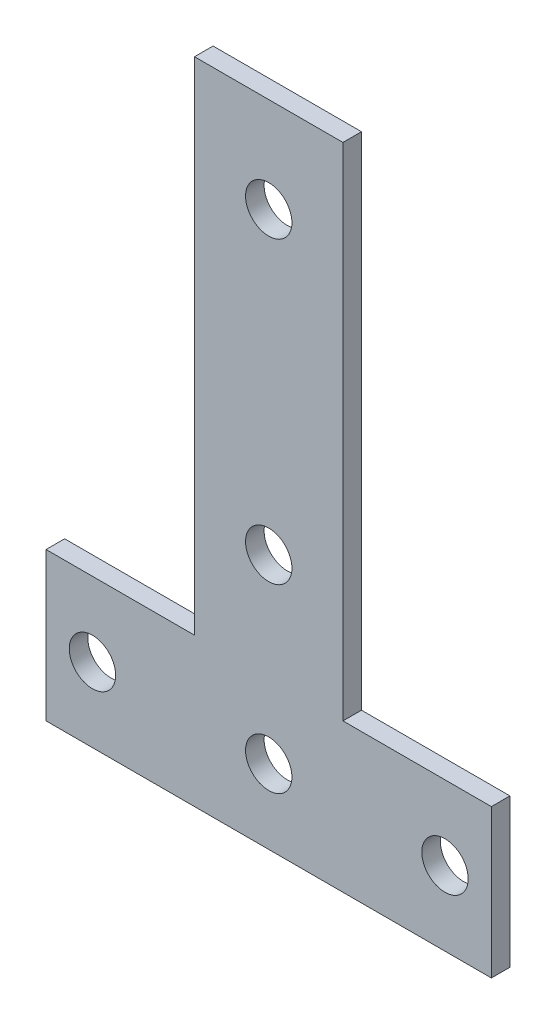
ISO-10303-21;
HEADER;
FILE_DESCRIPTION(('STEP AP214'),'2;1');
FILE_NAME('part.step','',(''),(''),'','','');
FILE_SCHEMA(('AUTOMOTIVE_DESIGN { 1 0 10303 214 1 1 1 1 }'));
ENDSEC;
DATA;
#1=APPLICATION_CONTEXT('core data for automotive mechanical design processes');
#2=APPLICATION_PROTOCOL_DEFINITION('international standard','automotive_design',2000,#1);
#3=PRODUCT_CONTEXT('',#1,'mechanical');
#4=PRODUCT('Part','Part','',(#3));
#5=PRODUCT_RELATED_PRODUCT_CATEGORY('part','',(#4));
#6=PRODUCT_DEFINITION_FORMATION('','',#4);
#7=PRODUCT_DEFINITION_CONTEXT('part definition',#1,'design');
#8=PRODUCT_DEFINITION('design','',#6,#7);
#9=PRODUCT_DEFINITION_SHAPE('','',#8);
#10=(LENGTH_UNIT() NAMED_UNIT(*) SI_UNIT(.MILLI.,.METRE.));
#11=(NAMED_UNIT(*) PLANE_ANGLE_UNIT() SI_UNIT($,.RADIAN.));
#12=(NAMED_UNIT(*) SI_UNIT($,.STERADIAN.) SOLID_ANGLE_UNIT());
#13=UNCERTAINTY_MEASURE_WITH_UNIT(LENGTH_MEASURE(1.E-05),#10,'distance_accuracy_value','');
#14=(GEOMETRIC_REPRESENTATION_CONTEXT(3) GLOBAL_UNCERTAINTY_ASSIGNED_CONTEXT((#13)) GLOBAL_UNIT_ASSIGNED_CONTEXT((#10,
#11,#12)) REPRESENTATION_CONTEXT('',''));
#15=CARTESIAN_POINT('',(0.,0.,0.));
#16=DIRECTION('',(0.,0.,1.));
#17=DIRECTION('',(1.,0.,0.));
#18=AXIS2_PLACEMENT_3D('',#15,#16,#17);
#19=CARTESIAN_POINT('',(0.,0.,2.));
#20=DIRECTION('',(0.,0.,1.));
#21=DIRECTION('',(1.,0.,0.));
#22=AXIS2_PLACEMENT_3D('',#19,#20,#21);
#23=PLANE('',#22);
#24=CARTESIAN_POINT('',(0.,43.75,2.));
#25=DIRECTION('',(0.,0.,1.));
#26=DIRECTION('',(1.,0.,0.));
#27=AXIS2_PLACEMENT_3D('',#24,#25,#26);
#28=CIRCLE('',#27,2.5);
#29=CARTESIAN_POINT('',(2.5,43.75,2.));
#30=VERTEX_POINT('',#29);
#31=EDGE_CURVE('E231',#30,#30,#28,.T.);
#32=ORIENTED_EDGE('',*,*,#31,.F.);
#33=EDGE_LOOP('',(#32));
#34=FACE_BOUND('',#33,.T.);
#35=CARTESIAN_POINT('',(0.,-8.,2.));
#36=DIRECTION('',(0.,0.,1.));
#37=DIRECTION('',(1.,0.,0.));
#38=AXIS2_PLACEMENT_3D('',#35,#36,#37);
#39=CIRCLE('',#38,2.5);
#40=CARTESIAN_POINT('',(2.50000000000001,-8.,2.));
#41=VERTEX_POINT('',#40);
#42=EDGE_CURVE('E215',#41,#41,#39,.T.);
#43=ORIENTED_EDGE('',*,*,#42,.F.);
#44=EDGE_LOOP('',(#43));
#45=FACE_BOUND('',#44,.T.);
#46=DIRECTION('',(-1.,0.,0.));
#47=VECTOR('',#46,1.);
#48=CARTESIAN_POINT('',(-24.,0.,2.));
#49=LINE('',#48,#47);
#50=CARTESIAN_POINT('',(-7.99999999999999,0.,2.));
#51=VERTEX_POINT('',#50);
#52=CARTESIAN_POINT('',(-24.,0.,2.));
#53=VERTEX_POINT('',#52);
#54=EDGE_CURVE('E166',#51,#53,#49,.T.);
#55=ORIENTED_EDGE('',*,*,#54,.T.);
#56=DIRECTION('',(0.,-1.,0.));
#57=VECTOR('',#56,1.);
#58=CARTESIAN_POINT('',(-24.,-16.,2.));
#59=LINE('',#58,#57);
#60=CARTESIAN_POINT('',(-24.,-16.,2.));
#61=VERTEX_POINT('',#60);
#62=EDGE_CURVE('E101',#53,#61,#59,.T.);
#63=ORIENTED_EDGE('',*,*,#62,.T.);
#64=DIRECTION('',(1.,0.,0.));
#65=VECTOR('',#64,1.);
#66=CARTESIAN_POINT('',(24.,-16.,2.));
#67=LINE('',#66,#65);
#68=CARTESIAN_POINT('',(24.,-16.,2.));
#69=VERTEX_POINT('',#68);
#70=EDGE_CURVE('E186',#61,#69,#67,.T.);
#71=ORIENTED_EDGE('',*,*,#70,.T.);
#72=DIRECTION('',(0.,1.,0.));
#73=VECTOR('',#72,1.);
#74=CARTESIAN_POINT('',(24.,0.,2.));
#75=LINE('',#74,#73);
#76=CARTESIAN_POINT('',(24.,0.,2.));
#77=VERTEX_POINT('',#76);
#78=EDGE_CURVE('E200',#69,#77,#75,.T.);
#79=ORIENTED_EDGE('',*,*,#78,.T.);
#80=DIRECTION('',(-1.,0.,0.));
#81=VECTOR('',#80,1.);
#82=CARTESIAN_POINT('',(8.,0.,2.));
#83=LINE('',#82,#81);
#84=CARTESIAN_POINT('',(8.,0.,2.));
#85=VERTEX_POINT('',#84);
#86=EDGE_CURVE('E120',#77,#85,#83,.T.);
#87=ORIENTED_EDGE('',*,*,#86,.T.);
#88=DIRECTION('',(0.,1.,0.));
#89=VECTOR('',#88,1.);
#90=CARTESIAN_POINT('',(8.,54.,2.));
#91=LINE('',#90,#89);
#92=CARTESIAN_POINT('',(8.,54.,2.));
#93=VERTEX_POINT('',#92);
#94=EDGE_CURVE('E114',#85,#93,#91,.T.);
#95=ORIENTED_EDGE('',*,*,#94,.T.);
#96=DIRECTION('',(-1.,0.,0.));
#97=VECTOR('',#96,1.);
#98=CARTESIAN_POINT('',(-8.,54.,2.));
#99=LINE('',#98,#97);
#100=CARTESIAN_POINT('',(-8.,54.,2.));
#101=VERTEX_POINT('',#100);
#102=EDGE_CURVE('E118',#93,#101,#99,.T.);
#103=ORIENTED_EDGE('',*,*,#102,.T.);
#104=DIRECTION('',(0.,-1.,0.));
#105=VECTOR('',#104,1.);
#106=CARTESIAN_POINT('',(-7.99999999999999,0.,2.));
#107=LINE('',#106,#105);
#108=EDGE_CURVE('E58',#101,#51,#107,.T.);
#109=ORIENTED_EDGE('',*,*,#108,.T.);
#110=EDGE_LOOP('',(#55,#63,#71,#79,#87,#95,#103,#109));
#111=FACE_BOUND('',#110,.T.);
#112=CARTESIAN_POINT('',(19.,-7.99999999999999,2.));
#113=DIRECTION('',(0.,0.,1.));
#114=DIRECTION('',(1.,0.,0.));
#115=AXIS2_PLACEMENT_3D('',#112,#113,#114);
#116=CIRCLE('',#115,2.5);
#117=CARTESIAN_POINT('',(21.5,-7.99999999999999,2.));
#118=VERTEX_POINT('',#117);
#119=EDGE_CURVE('E148',#118,#118,#116,.T.);
#120=ORIENTED_EDGE('',*,*,#119,.F.);
#121=EDGE_LOOP('',(#120));
#122=FACE_BOUND('',#121,.T.);
#123=CARTESIAN_POINT('',(-19.,-8.,2.));
#124=DIRECTION('',(0.,0.,1.));
#125=DIRECTION('',(1.,0.,0.));
#126=AXIS2_PLACEMENT_3D('',#123,#124,#125);
#127=CIRCLE('',#126,2.5);
#128=CARTESIAN_POINT('',(-16.5,-8.,2.));
#129=VERTEX_POINT('',#128);
#130=EDGE_CURVE('E223',#129,#129,#127,.T.);
#131=ORIENTED_EDGE('',*,*,#130,.F.);
#132=EDGE_LOOP('',(#131));
#133=FACE_BOUND('',#132,.T.);
#134=CARTESIAN_POINT('',(0.,11.5,2.));
#135=DIRECTION('',(0.,0.,1.));
#136=DIRECTION('',(1.,0.,0.));
#137=AXIS2_PLACEMENT_3D('',#134,#135,#136);
#138=CIRCLE('',#137,2.5);
#139=CARTESIAN_POINT('',(2.50000000000001,11.5,2.));
#140=VERTEX_POINT('',#139);
#141=EDGE_CURVE('E239',#140,#140,#138,.T.);
#142=ORIENTED_EDGE('',*,*,#141,.F.);
#143=EDGE_LOOP('',(#142));
#144=FACE_BOUND('',#143,.T.);
#145=ADVANCED_FACE('F40',(#34,#45,#111,#122,#133,#144),#23,.T.);
#146=CARTESIAN_POINT('',(0.,0.,0.));
#147=DIRECTION('',(0.,0.,1.));
#148=DIRECTION('',(1.,0.,0.));
#149=AXIS2_PLACEMENT_3D('',#146,#147,#148);
#150=PLANE('',#149);
#151=DIRECTION('',(-1.,0.,0.));
#152=VECTOR('',#151,1.);
#153=CARTESIAN_POINT('',(-24.,0.,0.));
#154=LINE('',#153,#152);
#155=CARTESIAN_POINT('',(-7.99999999999999,0.,0.));
#156=VERTEX_POINT('',#155);
#157=CARTESIAN_POINT('',(-24.,0.,0.));
#158=VERTEX_POINT('',#157);
#159=EDGE_CURVE('E143',#156,#158,#154,.T.);
#160=ORIENTED_EDGE('',*,*,#159,.F.);
#161=DIRECTION('',(0.,-1.,0.));
#162=VECTOR('',#161,1.);
#163=CARTESIAN_POINT('',(-7.99999999999999,0.,0.));
#164=LINE('',#163,#162);
#165=CARTESIAN_POINT('',(-8.,54.,0.));
#166=VERTEX_POINT('',#165);
#167=EDGE_CURVE('E93',#166,#156,#164,.T.);
#168=ORIENTED_EDGE('',*,*,#167,.F.);
#169=DIRECTION('',(-1.,0.,0.));
#170=VECTOR('',#169,1.);
#171=CARTESIAN_POINT('',(-8.,54.,0.));
#172=LINE('',#171,#170);
#173=CARTESIAN_POINT('',(8.,54.,0.));
#174=VERTEX_POINT('',#173);
#175=EDGE_CURVE('E87',#174,#166,#172,.T.);
#176=ORIENTED_EDGE('',*,*,#175,.F.);
#177=DIRECTION('',(0.,1.,0.));
#178=VECTOR('',#177,1.);
#179=CARTESIAN_POINT('',(8.,54.,0.));
#180=LINE('',#179,#178);
#181=CARTESIAN_POINT('',(8.,0.,0.));
#182=VERTEX_POINT('',#181);
#183=EDGE_CURVE('E129',#182,#174,#180,.T.);
#184=ORIENTED_EDGE('',*,*,#183,.F.);
#185=DIRECTION('',(-1.,0.,0.));
#186=VECTOR('',#185,1.);
#187=CARTESIAN_POINT('',(8.,0.,0.));
#188=LINE('',#187,#186);
#189=CARTESIAN_POINT('',(24.,0.,0.));
#190=VERTEX_POINT('',#189);
#191=EDGE_CURVE('E157',#190,#182,#188,.T.);
#192=ORIENTED_EDGE('',*,*,#191,.F.);
#193=DIRECTION('',(0.,1.,0.));
#194=VECTOR('',#193,1.);
#195=CARTESIAN_POINT('',(24.,0.,0.));
#196=LINE('',#195,#194);
#197=CARTESIAN_POINT('',(24.,-16.,0.));
#198=VERTEX_POINT('',#197);
#199=EDGE_CURVE('E154',#198,#190,#196,.T.);
#200=ORIENTED_EDGE('',*,*,#199,.F.);
#201=DIRECTION('',(1.,0.,0.));
#202=VECTOR('',#201,1.);
#203=CARTESIAN_POINT('',(24.,-16.,0.));
#204=LINE('',#203,#202);
#205=CARTESIAN_POINT('',(-24.,-16.,0.));
#206=VERTEX_POINT('',#205);
#207=EDGE_CURVE('E151',#206,#198,#204,.T.);
#208=ORIENTED_EDGE('',*,*,#207,.F.);
#209=DIRECTION('',(0.,-1.,0.));
#210=VECTOR('',#209,1.);
#211=CARTESIAN_POINT('',(-24.,-16.,0.));
#212=LINE('',#211,#210);
#213=EDGE_CURVE('E147',#158,#206,#212,.T.);
#214=ORIENTED_EDGE('',*,*,#213,.F.);
#215=EDGE_LOOP('',(#160,#168,#176,#184,#192,#200,#208,#214));
#216=FACE_BOUND('',#215,.T.);
#217=CARTESIAN_POINT('',(19.,-7.99999999999999,0.));
#218=DIRECTION('',(0.,0.,1.));
#219=DIRECTION('',(1.,0.,0.));
#220=AXIS2_PLACEMENT_3D('',#217,#218,#219);
#221=CIRCLE('',#220,2.5);
#222=CARTESIAN_POINT('',(21.5,-7.99999999999999,0.));
#223=VERTEX_POINT('',#222);
#224=EDGE_CURVE('E211',#223,#223,#221,.T.);
#225=ORIENTED_EDGE('',*,*,#224,.T.);
#226=EDGE_LOOP('',(#225));
#227=FACE_BOUND('',#226,.T.);
#228=CARTESIAN_POINT('',(0.,-8.,0.));
#229=DIRECTION('',(0.,0.,1.));
#230=DIRECTION('',(1.,0.,0.));
#231=AXIS2_PLACEMENT_3D('',#228,#229,#230);
#232=CIRCLE('',#231,2.5);
#233=CARTESIAN_POINT('',(2.50000000000001,-8.,0.));
#234=VERTEX_POINT('',#233);
#235=EDGE_CURVE('E219',#234,#234,#232,.T.);
#236=ORIENTED_EDGE('',*,*,#235,.T.);
#237=EDGE_LOOP('',(#236));
#238=FACE_BOUND('',#237,.T.);
#239=CARTESIAN_POINT('',(-19.,-8.,0.));
#240=DIRECTION('',(0.,0.,1.));
#241=DIRECTION('',(1.,0.,0.));
#242=AXIS2_PLACEMENT_3D('',#239,#240,#241);
#243=CIRCLE('',#242,2.5);
#244=CARTESIAN_POINT('',(-16.5,-8.,0.));
#245=VERTEX_POINT('',#244);
#246=EDGE_CURVE('E227',#245,#245,#243,.T.);
#247=ORIENTED_EDGE('',*,*,#246,.T.);
#248=EDGE_LOOP('',(#247));
#249=FACE_BOUND('',#248,.T.);
#250=CARTESIAN_POINT('',(0.,43.75,0.));
#251=DIRECTION('',(0.,0.,1.));
#252=DIRECTION('',(1.,0.,0.));
#253=AXIS2_PLACEMENT_3D('',#250,#251,#252);
#254=CIRCLE('',#253,2.5);
#255=CARTESIAN_POINT('',(2.5,43.75,0.));
#256=VERTEX_POINT('',#255);
#257=EDGE_CURVE('E235',#256,#256,#254,.T.);
#258=ORIENTED_EDGE('',*,*,#257,.T.);
#259=EDGE_LOOP('',(#258));
#260=FACE_BOUND('',#259,.T.);
#261=CARTESIAN_POINT('',(0.,11.5,0.));
#262=DIRECTION('',(0.,0.,1.));
#263=DIRECTION('',(1.,0.,0.));
#264=AXIS2_PLACEMENT_3D('',#261,#262,#263);
#265=CIRCLE('',#264,2.5);
#266=CARTESIAN_POINT('',(2.50000000000001,11.5,0.));
#267=VERTEX_POINT('',#266);
#268=EDGE_CURVE('E243',#267,#267,#265,.T.);
#269=ORIENTED_EDGE('',*,*,#268,.T.);
#270=EDGE_LOOP('',(#269));
#271=FACE_BOUND('',#270,.T.);
#272=ADVANCED_FACE('F190',(#216,#227,#238,#249,#260,#271),#150,.F.);
#273=CARTESIAN_POINT('',(-24.,0.,2.));
#274=DIRECTION('',(0.,-1.,0.));
#275=DIRECTION('',(0.,0.,-1.));
#276=AXIS2_PLACEMENT_3D('',#273,#274,#275);
#277=PLANE('',#276);
#278=ORIENTED_EDGE('',*,*,#159,.T.);
#279=DIRECTION('',(0.,0.,-1.));
#280=VECTOR('',#279,1.);
#281=CARTESIAN_POINT('',(-24.,0.,2.));
#282=LINE('',#281,#280);
#283=EDGE_CURVE('E11',#53,#158,#282,.T.);
#284=ORIENTED_EDGE('',*,*,#283,.F.);
#285=ORIENTED_EDGE('',*,*,#54,.F.);
#286=DIRECTION('',(0.,0.,-1.));
#287=VECTOR('',#286,1.);
#288=CARTESIAN_POINT('',(-7.99999999999999,0.,2.));
#289=LINE('',#288,#287);
#290=EDGE_CURVE('E139',#51,#156,#289,.T.);
#291=ORIENTED_EDGE('',*,*,#290,.T.);
#292=EDGE_LOOP('',(#278,#284,#285,#291));
#293=FACE_BOUND('',#292,.T.);
#294=ADVANCED_FACE('F42',(#293),#277,.F.);
#295=CARTESIAN_POINT('',(-24.,-16.,2.));
#296=DIRECTION('',(1.,0.,0.));
#297=DIRECTION('',(0.,0.,-1.));
#298=AXIS2_PLACEMENT_3D('',#295,#296,#297);
#299=PLANE('',#298);
#300=ORIENTED_EDGE('',*,*,#213,.T.);
#301=DIRECTION('',(0.,0.,-1.));
#302=VECTOR('',#301,1.);
#303=CARTESIAN_POINT('',(-24.,-16.,2.));
#304=LINE('',#303,#302);
#305=EDGE_CURVE('E50',#61,#206,#304,.T.);
#306=ORIENTED_EDGE('',*,*,#305,.F.);
#307=ORIENTED_EDGE('',*,*,#62,.F.);
#308=ORIENTED_EDGE('',*,*,#283,.T.);
#309=EDGE_LOOP('',(#300,#306,#307,#308));
#310=FACE_BOUND('',#309,.T.);
#311=ADVANCED_FACE('F278',(#310),#299,.F.);
#312=CARTESIAN_POINT('',(24.,-16.,2.));
#313=DIRECTION('',(0.,1.,0.));
#314=DIRECTION('',(-1.,0.,0.));
#315=AXIS2_PLACEMENT_3D('',#312,#313,#314);
#316=PLANE('',#315);
#317=ORIENTED_EDGE('',*,*,#207,.T.);
#318=DIRECTION('',(0.,0.,-1.));
#319=VECTOR('',#318,1.);
#320=CARTESIAN_POINT('',(24.,-16.,2.));
#321=LINE('',#320,#319);
#322=EDGE_CURVE('E176',#69,#198,#321,.T.);
#323=ORIENTED_EDGE('',*,*,#322,.F.);
#324=ORIENTED_EDGE('',*,*,#70,.F.);
#325=ORIENTED_EDGE('',*,*,#305,.T.);
#326=EDGE_LOOP('',(#317,#323,#324,#325));
#327=FACE_BOUND('',#326,.T.);
#328=ADVANCED_FACE('F184',(#327),#316,.F.);
#329=CARTESIAN_POINT('',(24.,0.,2.));
#330=DIRECTION('',(-1.,0.,0.));
#331=DIRECTION('',(0.,-1.,0.));
#332=AXIS2_PLACEMENT_3D('',#329,#330,#331);
#333=PLANE('',#332);
#334=ORIENTED_EDGE('',*,*,#199,.T.);
#335=DIRECTION('',(0.,0.,-1.));
#336=VECTOR('',#335,1.);
#337=CARTESIAN_POINT('',(24.,0.,2.));
#338=LINE('',#337,#336);
#339=EDGE_CURVE('E172',#77,#190,#338,.T.);
#340=ORIENTED_EDGE('',*,*,#339,.F.);
#341=ORIENTED_EDGE('',*,*,#78,.F.);
#342=ORIENTED_EDGE('',*,*,#322,.T.);
#343=EDGE_LOOP('',(#334,#340,#341,#342));
#344=FACE_BOUND('',#343,.T.);
#345=ADVANCED_FACE('F195',(#344),#333,.F.);
#346=CARTESIAN_POINT('',(8.,0.,2.));
#347=DIRECTION('',(0.,-1.,0.));
#348=DIRECTION('',(1.,0.,0.));
#349=AXIS2_PLACEMENT_3D('',#346,#347,#348);
#350=PLANE('',#349);
#351=ORIENTED_EDGE('',*,*,#191,.T.);
#352=DIRECTION('',(0.,0.,-1.));
#353=VECTOR('',#352,1.);
#354=CARTESIAN_POINT('',(8.,0.,2.));
#355=LINE('',#354,#353);
#356=EDGE_CURVE('E131',#85,#182,#355,.T.);
#357=ORIENTED_EDGE('',*,*,#356,.F.);
#358=ORIENTED_EDGE('',*,*,#86,.F.);
#359=ORIENTED_EDGE('',*,*,#339,.T.);
#360=EDGE_LOOP('',(#351,#357,#358,#359));
#361=FACE_BOUND('',#360,.T.);
#362=ADVANCED_FACE('F198',(#361),#350,.F.);
#363=CARTESIAN_POINT('',(8.,54.,2.));
#364=DIRECTION('',(-1.,0.,0.));
#365=DIRECTION('',(0.,-1.,0.));
#366=AXIS2_PLACEMENT_3D('',#363,#364,#365);
#367=PLANE('',#366);
#368=ORIENTED_EDGE('',*,*,#183,.T.);
#369=DIRECTION('',(0.,0.,-1.));
#370=VECTOR('',#369,1.);
#371=CARTESIAN_POINT('',(8.,54.,2.));
#372=LINE('',#371,#370);
#373=EDGE_CURVE('E126',#93,#174,#372,.T.);
#374=ORIENTED_EDGE('',*,*,#373,.F.);
#375=ORIENTED_EDGE('',*,*,#94,.F.);
#376=ORIENTED_EDGE('',*,*,#356,.T.);
#377=EDGE_LOOP('',(#368,#374,#375,#376));
#378=FACE_BOUND('',#377,.T.);
#379=ADVANCED_FACE('F127',(#378),#367,.F.);
#380=CARTESIAN_POINT('',(-8.,54.,2.));
#381=DIRECTION('',(0.,-1.,0.));
#382=DIRECTION('',(0.,0.,-1.));
#383=AXIS2_PLACEMENT_3D('',#380,#381,#382);
#384=PLANE('',#383);
#385=ORIENTED_EDGE('',*,*,#175,.T.);
#386=DIRECTION('',(0.,0.,-1.));
#387=VECTOR('',#386,1.);
#388=CARTESIAN_POINT('',(-8.,54.,2.));
#389=LINE('',#388,#387);
#390=EDGE_CURVE('E132',#101,#166,#389,.T.);
#391=ORIENTED_EDGE('',*,*,#390,.F.);
#392=ORIENTED_EDGE('',*,*,#102,.F.);
#393=ORIENTED_EDGE('',*,*,#373,.T.);
#394=EDGE_LOOP('',(#385,#391,#392,#393));
#395=FACE_BOUND('',#394,.T.);
#396=ADVANCED_FACE('F134',(#395),#384,.F.);
#397=CARTESIAN_POINT('',(-7.99999999999999,0.,2.));
#398=DIRECTION('',(1.,0.,0.));
#399=DIRECTION('',(0.,1.,0.));
#400=AXIS2_PLACEMENT_3D('',#397,#398,#399);
#401=PLANE('',#400);
#402=ORIENTED_EDGE('',*,*,#167,.T.);
#403=ORIENTED_EDGE('',*,*,#290,.F.);
#404=ORIENTED_EDGE('',*,*,#108,.F.);
#405=ORIENTED_EDGE('',*,*,#390,.T.);
#406=EDGE_LOOP('',(#402,#403,#404,#405));
#407=FACE_BOUND('',#406,.T.);
#408=ADVANCED_FACE('F266',(#407),#401,.F.);
#409=CARTESIAN_POINT('',(19.,-7.99999999999999,2.));
#410=DIRECTION('',(0.,0.,-1.));
#411=DIRECTION('',(-1.,0.,0.));
#412=AXIS2_PLACEMENT_3D('',#409,#410,#411);
#413=CYLINDRICAL_SURFACE('',#412,2.5);
#414=ORIENTED_EDGE('',*,*,#119,.T.);
#415=EDGE_LOOP('',(#414));
#416=FACE_BOUND('',#415,.T.);
#417=ORIENTED_EDGE('',*,*,#224,.F.);
#418=EDGE_LOOP('',(#417));
#419=FACE_BOUND('',#418,.T.);
#420=ADVANCED_FACE('F263',(#416,#419),#413,.F.);
#421=CARTESIAN_POINT('',(0.,-8.,2.));
#422=DIRECTION('',(0.,0.,-1.));
#423=DIRECTION('',(-1.,0.,0.));
#424=AXIS2_PLACEMENT_3D('',#421,#422,#423);
#425=CYLINDRICAL_SURFACE('',#424,2.5);
#426=ORIENTED_EDGE('',*,*,#42,.T.);
#427=EDGE_LOOP('',(#426));
#428=FACE_BOUND('',#427,.T.);
#429=ORIENTED_EDGE('',*,*,#235,.F.);
#430=EDGE_LOOP('',(#429));
#431=FACE_BOUND('',#430,.T.);
#432=ADVANCED_FACE('F352',(#428,#431),#425,.F.);
#433=CARTESIAN_POINT('',(-19.,-8.,2.));
#434=DIRECTION('',(0.,0.,-1.));
#435=DIRECTION('',(-1.,0.,0.));
#436=AXIS2_PLACEMENT_3D('',#433,#434,#435);
#437=CYLINDRICAL_SURFACE('',#436,2.5);
#438=ORIENTED_EDGE('',*,*,#130,.T.);
#439=EDGE_LOOP('',(#438));
#440=FACE_BOUND('',#439,.T.);
#441=ORIENTED_EDGE('',*,*,#246,.F.);
#442=EDGE_LOOP('',(#441));
#443=FACE_BOUND('',#442,.T.);
#444=ADVANCED_FACE('F361',(#440,#443),#437,.F.);
#445=CARTESIAN_POINT('',(0.,43.75,2.));
#446=DIRECTION('',(0.,0.,-1.));
#447=DIRECTION('',(-1.,0.,0.));
#448=AXIS2_PLACEMENT_3D('',#445,#446,#447);
#449=CYLINDRICAL_SURFACE('',#448,2.5);
#450=ORIENTED_EDGE('',*,*,#31,.T.);
#451=EDGE_LOOP('',(#450));
#452=FACE_BOUND('',#451,.T.);
#453=ORIENTED_EDGE('',*,*,#257,.F.);
#454=EDGE_LOOP('',(#453));
#455=FACE_BOUND('',#454,.T.);
#456=ADVANCED_FACE('F370',(#452,#455),#449,.F.);
#457=CARTESIAN_POINT('',(0.,11.5,2.));
#458=DIRECTION('',(0.,0.,-1.));
#459=DIRECTION('',(-1.,0.,0.));
#460=AXIS2_PLACEMENT_3D('',#457,#458,#459);
#461=CYLINDRICAL_SURFACE('',#460,2.5);
#462=ORIENTED_EDGE('',*,*,#141,.T.);
#463=EDGE_LOOP('',(#462));
#464=FACE_BOUND('',#463,.T.);
#465=ORIENTED_EDGE('',*,*,#268,.F.);
#466=EDGE_LOOP('',(#465));
#467=FACE_BOUND('',#466,.T.);
#468=ADVANCED_FACE('F250',(#464,#467),#461,.F.);
#469=CLOSED_SHELL('',(#145,#272,#294,#311,#328,#345,#362,#379,#396,#408,#420,#432,#444,#456,#468));
#470=MANIFOLD_SOLID_BREP('B2',#469);
#471=ADVANCED_BREP_SHAPE_REPRESENTATION('',(#18,#470),#14);
#472=SHAPE_DEFINITION_REPRESENTATION(#9,#471);
ENDSEC;
END-ISO-10303-21;
